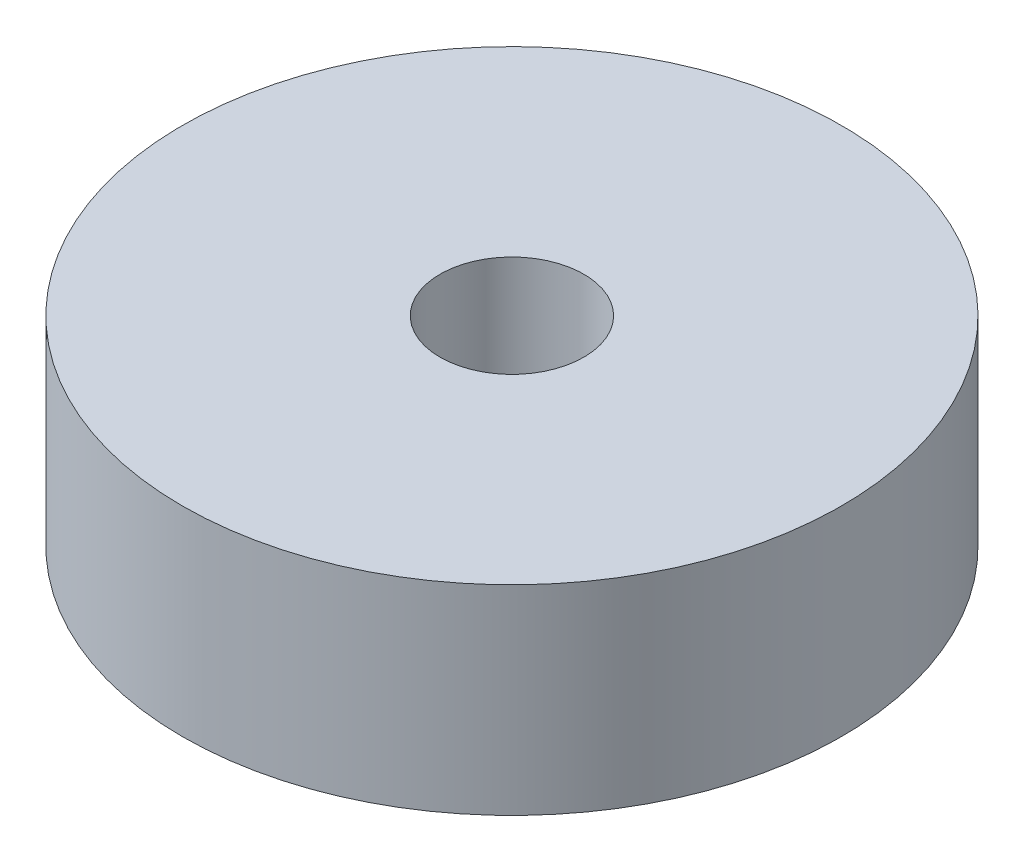
ISO-10303-21;
HEADER;
FILE_DESCRIPTION(('STEP AP214'),'2;1');
FILE_NAME('part.step','',(''),(''),'','','');
FILE_SCHEMA(('AUTOMOTIVE_DESIGN { 1 0 10303 214 1 1 1 1 }'));
ENDSEC;
DATA;
#1=APPLICATION_CONTEXT('core data for automotive mechanical design processes');
#2=APPLICATION_PROTOCOL_DEFINITION('international standard','automotive_design',2000,#1);
#3=PRODUCT_CONTEXT('',#1,'mechanical');
#4=PRODUCT('Part','Part','',(#3));
#5=PRODUCT_RELATED_PRODUCT_CATEGORY('part','',(#4));
#6=PRODUCT_DEFINITION_FORMATION('','',#4);
#7=PRODUCT_DEFINITION_CONTEXT('part definition',#1,'design');
#8=PRODUCT_DEFINITION('design','',#6,#7);
#9=PRODUCT_DEFINITION_SHAPE('','',#8);
#10=(LENGTH_UNIT() NAMED_UNIT(*) SI_UNIT(.MILLI.,.METRE.));
#11=(NAMED_UNIT(*) PLANE_ANGLE_UNIT() SI_UNIT($,.RADIAN.));
#12=(NAMED_UNIT(*) SI_UNIT($,.STERADIAN.) SOLID_ANGLE_UNIT());
#13=UNCERTAINTY_MEASURE_WITH_UNIT(LENGTH_MEASURE(1.E-05),#10,'distance_accuracy_value','');
#14=(GEOMETRIC_REPRESENTATION_CONTEXT(3) GLOBAL_UNCERTAINTY_ASSIGNED_CONTEXT((#13)) GLOBAL_UNIT_ASSIGNED_CONTEXT((#10,
#11,#12)) REPRESENTATION_CONTEXT('',''));
#15=CARTESIAN_POINT('',(0.,0.,0.));
#16=DIRECTION('',(0.,0.,1.));
#17=DIRECTION('',(1.,0.,0.));
#18=AXIS2_PLACEMENT_3D('',#15,#16,#17);
#19=CARTESIAN_POINT('',(0.,6.35,0.));
#20=DIRECTION('',(0.,-1.,0.));
#21=DIRECTION('',(0.,0.,-1.));
#22=AXIS2_PLACEMENT_3D('',#19,#20,#21);
#23=CYLINDRICAL_SURFACE('',#22,10.475);
#24=CARTESIAN_POINT('',(0.,6.35,0.));
#25=DIRECTION('',(0.,1.,0.));
#26=DIRECTION('',(0.,0.,1.));
#27=AXIS2_PLACEMENT_3D('',#24,#25,#26);
#28=CIRCLE('',#27,10.475);
#29=CARTESIAN_POINT('',(0.,6.35,10.475));
#30=VERTEX_POINT('',#29);
#31=EDGE_CURVE('E10',#30,#30,#28,.T.);
#32=ORIENTED_EDGE('',*,*,#31,.F.);
#33=EDGE_LOOP('',(#32));
#34=FACE_BOUND('',#33,.T.);
#35=CARTESIAN_POINT('',(0.,0.,0.));
#36=DIRECTION('',(0.,1.,0.));
#37=DIRECTION('',(0.,0.,1.));
#38=AXIS2_PLACEMENT_3D('',#35,#36,#37);
#39=CIRCLE('',#38,10.475);
#40=CARTESIAN_POINT('',(0.,0.,10.475));
#41=VERTEX_POINT('',#40);
#42=EDGE_CURVE('E36',#41,#41,#39,.T.);
#43=ORIENTED_EDGE('',*,*,#42,.T.);
#44=EDGE_LOOP('',(#43));
#45=FACE_BOUND('',#44,.T.);
#46=ADVANCED_FACE('F33',(#34,#45),#23,.T.);
#47=CARTESIAN_POINT('',(0.,6.35,0.));
#48=DIRECTION('',(0.,1.,0.));
#49=DIRECTION('',(0.,0.,1.));
#50=AXIS2_PLACEMENT_3D('',#47,#48,#49);
#51=PLANE('',#50);
#52=ORIENTED_EDGE('',*,*,#31,.T.);
#53=EDGE_LOOP('',(#52));
#54=FACE_BOUND('',#53,.T.);
#55=CARTESIAN_POINT('',(0.,6.35,0.));
#56=DIRECTION('',(0.,1.,0.));
#57=DIRECTION('',(0.,0.,1.));
#58=AXIS2_PLACEMENT_3D('',#55,#56,#57);
#59=CIRCLE('',#58,2.286);
#60=CARTESIAN_POINT('',(0.,6.35,2.286));
#61=VERTEX_POINT('',#60);
#62=EDGE_CURVE('E43',#61,#61,#59,.T.);
#63=ORIENTED_EDGE('',*,*,#62,.F.);
#64=EDGE_LOOP('',(#63));
#65=FACE_BOUND('',#64,.T.);
#66=ADVANCED_FACE('F54',(#54,#65),#51,.T.);
#67=CARTESIAN_POINT('',(0.,0.,0.));
#68=DIRECTION('',(0.,1.,0.));
#69=DIRECTION('',(0.,0.,1.));
#70=AXIS2_PLACEMENT_3D('',#67,#68,#69);
#71=PLANE('',#70);
#72=ORIENTED_EDGE('',*,*,#42,.F.);
#73=EDGE_LOOP('',(#72));
#74=FACE_BOUND('',#73,.T.);
#75=CARTESIAN_POINT('',(0.,0.,0.));
#76=DIRECTION('',(0.,1.,0.));
#77=DIRECTION('',(0.,0.,1.));
#78=AXIS2_PLACEMENT_3D('',#75,#76,#77);
#79=CIRCLE('',#78,2.286);
#80=CARTESIAN_POINT('',(0.,0.,2.286));
#81=VERTEX_POINT('',#80);
#82=EDGE_CURVE('E45',#81,#81,#79,.T.);
#83=ORIENTED_EDGE('',*,*,#82,.T.);
#84=EDGE_LOOP('',(#83));
#85=FACE_BOUND('',#84,.T.);
#86=ADVANCED_FACE('F56',(#74,#85),#71,.F.);
#87=CARTESIAN_POINT('',(0.,6.35,0.));
#88=DIRECTION('',(0.,-1.,0.));
#89=DIRECTION('',(0.,0.,-1.));
#90=AXIS2_PLACEMENT_3D('',#87,#88,#89);
#91=CYLINDRICAL_SURFACE('',#90,2.286);
#92=ORIENTED_EDGE('',*,*,#62,.T.);
#93=EDGE_LOOP('',(#92));
#94=FACE_BOUND('',#93,.T.);
#95=ORIENTED_EDGE('',*,*,#82,.F.);
#96=EDGE_LOOP('',(#95));
#97=FACE_BOUND('',#96,.T.);
#98=ADVANCED_FACE('F51',(#94,#97),#91,.F.);
#99=CLOSED_SHELL('',(#46,#66,#86,#98));
#100=MANIFOLD_SOLID_BREP('B2',#99);
#101=ADVANCED_BREP_SHAPE_REPRESENTATION('',(#18,#100),#14);
#102=SHAPE_DEFINITION_REPRESENTATION(#9,#101);
ENDSEC;
END-ISO-10303-21;
